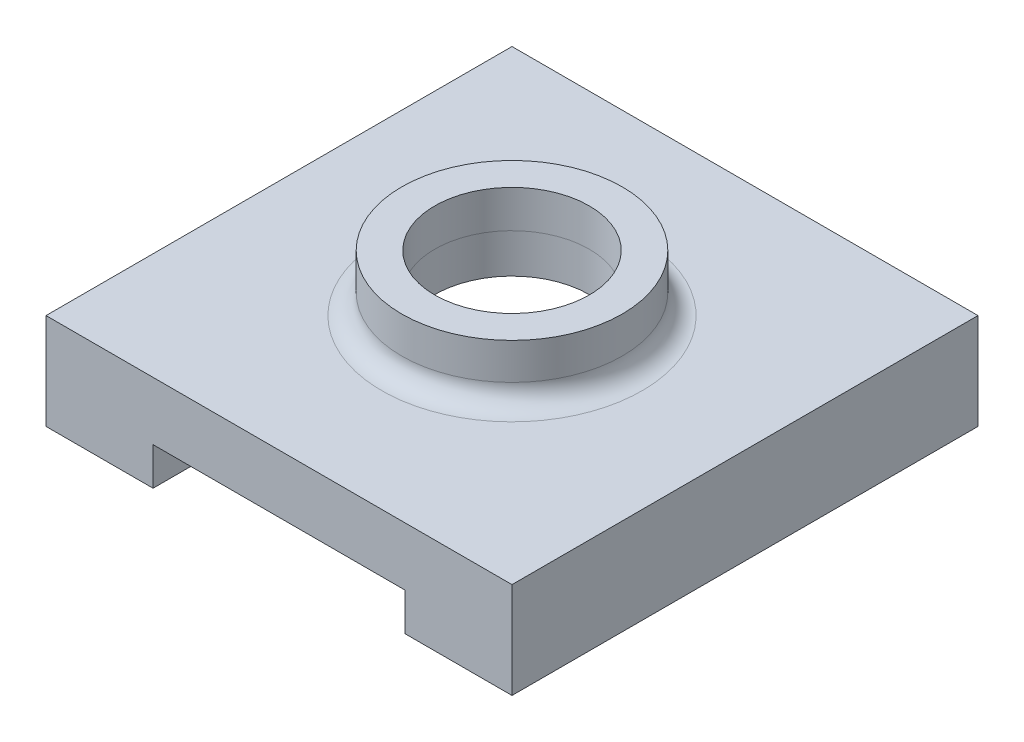
ISO-10303-21;
HEADER;
FILE_DESCRIPTION(('STEP AP214'),'2;1');
FILE_NAME('part.step','',(''),(''),'','','');
FILE_SCHEMA(('AUTOMOTIVE_DESIGN { 1 0 10303 214 1 1 1 1 }'));
ENDSEC;
DATA;
#1=APPLICATION_CONTEXT('core data for automotive mechanical design processes');
#2=APPLICATION_PROTOCOL_DEFINITION('international standard','automotive_design',2000,#1);
#3=PRODUCT_CONTEXT('',#1,'mechanical');
#4=PRODUCT('Part','Part','',(#3));
#5=PRODUCT_RELATED_PRODUCT_CATEGORY('part','',(#4));
#6=PRODUCT_DEFINITION_FORMATION('','',#4);
#7=PRODUCT_DEFINITION_CONTEXT('part definition',#1,'design');
#8=PRODUCT_DEFINITION('design','',#6,#7);
#9=PRODUCT_DEFINITION_SHAPE('','',#8);
#10=(LENGTH_UNIT() NAMED_UNIT(*) SI_UNIT(.MILLI.,.METRE.));
#11=(NAMED_UNIT(*) PLANE_ANGLE_UNIT() SI_UNIT($,.RADIAN.));
#12=(NAMED_UNIT(*) SI_UNIT($,.STERADIAN.) SOLID_ANGLE_UNIT());
#13=UNCERTAINTY_MEASURE_WITH_UNIT(LENGTH_MEASURE(1.E-05),#10,'distance_accuracy_value','');
#14=(GEOMETRIC_REPRESENTATION_CONTEXT(3) GLOBAL_UNCERTAINTY_ASSIGNED_CONTEXT((#13)) GLOBAL_UNIT_ASSIGNED_CONTEXT((#10,
#11,#12)) REPRESENTATION_CONTEXT('',''));
#15=CARTESIAN_POINT('',(0.,0.,0.));
#16=DIRECTION('',(0.,0.,1.));
#17=DIRECTION('',(1.,0.,0.));
#18=AXIS2_PLACEMENT_3D('',#15,#16,#17);
#19=CARTESIAN_POINT('',(0.,18.25,0.));
#20=DIRECTION('',(0.,1.,0.));
#21=DIRECTION('',(0.,0.,1.));
#22=AXIS2_PLACEMENT_3D('',#19,#20,#21);
#23=CYLINDRICAL_SURFACE('',#22,12.2682);
#24=CARTESIAN_POINT('',(0.,18.25,0.));
#25=DIRECTION('',(0.,1.,0.));
#26=DIRECTION('',(0.,0.,1.));
#27=AXIS2_PLACEMENT_3D('',#24,#25,#26);
#28=CIRCLE('',#27,12.2682);
#29=CARTESIAN_POINT('',(0.,18.25,12.2682));
#30=VERTEX_POINT('',#29);
#31=EDGE_CURVE('E336',#30,#30,#28,.F.);
#32=ORIENTED_EDGE('',*,*,#31,.F.);
#33=EDGE_LOOP('',(#32));
#34=FACE_BOUND('',#33,.T.);
#35=CARTESIAN_POINT('',(0.,12.,0.));
#36=DIRECTION('',(0.,-1.,0.));
#37=DIRECTION('',(0.,0.,-1.));
#38=AXIS2_PLACEMENT_3D('',#35,#36,#37);
#39=CIRCLE('',#38,12.2682);
#40=CARTESIAN_POINT('',(0.,12.,-12.2682));
#41=VERTEX_POINT('',#40);
#42=EDGE_CURVE('E49',#41,#41,#39,.F.);
#43=ORIENTED_EDGE('',*,*,#42,.F.);
#44=EDGE_LOOP('',(#43));
#45=FACE_BOUND('',#44,.T.);
#46=ADVANCED_FACE('F45',(#34,#45),#23,.F.);
#47=CARTESIAN_POINT('',(-20.,6.,-40.));
#48=DIRECTION('',(-1.,0.,0.));
#49=DIRECTION('',(0.,0.,1.));
#50=AXIS2_PLACEMENT_3D('',#47,#48,#49);
#51=PLANE('',#50);
#52=DIRECTION('',(0.,1.,0.));
#53=VECTOR('',#52,1.);
#54=CARTESIAN_POINT('',(-20.,5.99999999999999,37.));
#55=LINE('',#54,#53);
#56=CARTESIAN_POINT('',(-20.,0.,37.));
#57=VERTEX_POINT('',#56);
#58=CARTESIAN_POINT('',(-20.,6.,37.));
#59=VERTEX_POINT('',#58);
#60=EDGE_CURVE('E272',#57,#59,#55,.T.);
#61=ORIENTED_EDGE('',*,*,#60,.F.);
#62=DIRECTION('',(0.,0.,-1.));
#63=VECTOR('',#62,1.);
#64=CARTESIAN_POINT('',(-20.,0.,-40.));
#65=LINE('',#64,#63);
#66=CARTESIAN_POINT('',(-20.,0.,25.));
#67=VERTEX_POINT('',#66);
#68=EDGE_CURVE('E347',#57,#67,#65,.T.);
#69=ORIENTED_EDGE('',*,*,#68,.T.);
#70=DIRECTION('',(0.,1.,0.));
#71=VECTOR('',#70,1.);
#72=CARTESIAN_POINT('',(-20.,6.,25.));
#73=LINE('',#72,#71);
#74=CARTESIAN_POINT('',(-20.,6.,25.));
#75=VERTEX_POINT('',#74);
#76=EDGE_CURVE('E324',#67,#75,#73,.T.);
#77=ORIENTED_EDGE('',*,*,#76,.T.);
#78=DIRECTION('',(0.,0.,-1.));
#79=VECTOR('',#78,1.);
#80=CARTESIAN_POINT('',(-20.,6.,-40.));
#81=LINE('',#80,#79);
#82=EDGE_CURVE('E340',#59,#75,#81,.T.);
#83=ORIENTED_EDGE('',*,*,#82,.F.);
#84=EDGE_LOOP('',(#61,#69,#77,#83));
#85=FACE_BOUND('',#84,.T.);
#86=ADVANCED_FACE('F437',(#85),#51,.F.);
#87=CARTESIAN_POINT('',(20.,6.,40.));
#88=DIRECTION('',(1.,0.,0.));
#89=DIRECTION('',(0.,0.,-1.));
#90=AXIS2_PLACEMENT_3D('',#87,#88,#89);
#91=PLANE('',#90);
#92=DIRECTION('',(0.,-1.,0.));
#93=VECTOR('',#92,1.);
#94=CARTESIAN_POINT('',(20.,6.,37.));
#95=LINE('',#94,#93);
#96=CARTESIAN_POINT('',(20.,6.,37.));
#97=VERTEX_POINT('',#96);
#98=CARTESIAN_POINT('',(20.,0.,37.));
#99=VERTEX_POINT('',#98);
#100=EDGE_CURVE('E270',#97,#99,#95,.T.);
#101=ORIENTED_EDGE('',*,*,#100,.F.);
#102=DIRECTION('',(0.,0.,1.));
#103=VECTOR('',#102,1.);
#104=CARTESIAN_POINT('',(20.,6.,40.));
#105=LINE('',#104,#103);
#106=CARTESIAN_POINT('',(20.,6.,25.));
#107=VERTEX_POINT('',#106);
#108=EDGE_CURVE('E342',#107,#97,#105,.T.);
#109=ORIENTED_EDGE('',*,*,#108,.F.);
#110=DIRECTION('',(0.,-1.,0.));
#111=VECTOR('',#110,1.);
#112=CARTESIAN_POINT('',(20.,6.,25.));
#113=LINE('',#112,#111);
#114=CARTESIAN_POINT('',(20.,0.,25.));
#115=VERTEX_POINT('',#114);
#116=EDGE_CURVE('E321',#107,#115,#113,.T.);
#117=ORIENTED_EDGE('',*,*,#116,.T.);
#118=DIRECTION('',(0.,0.,1.));
#119=VECTOR('',#118,1.);
#120=CARTESIAN_POINT('',(20.,0.,40.));
#121=LINE('',#120,#119);
#122=EDGE_CURVE('E349',#115,#99,#121,.T.);
#123=ORIENTED_EDGE('',*,*,#122,.T.);
#124=EDGE_LOOP('',(#101,#109,#117,#123));
#125=FACE_BOUND('',#124,.T.);
#126=ADVANCED_FACE('F462',(#125),#91,.F.);
#127=CARTESIAN_POINT('',(0.,6.,0.));
#128=DIRECTION('',(0.,1.,0.));
#129=DIRECTION('',(0.,0.,1.));
#130=AXIS2_PLACEMENT_3D('',#127,#128,#129);
#131=PLANE('',#130);
#132=DIRECTION('',(1.,0.,0.));
#133=VECTOR('',#132,1.);
#134=CARTESIAN_POINT('',(0.,6.,37.));
#135=LINE('',#134,#133);
#136=EDGE_CURVE('E263',#59,#97,#135,.T.);
#137=ORIENTED_EDGE('',*,*,#136,.F.);
#138=ORIENTED_EDGE('',*,*,#82,.T.);
#139=DIRECTION('',(1.,0.,0.));
#140=VECTOR('',#139,1.);
#141=CARTESIAN_POINT('',(0.,6.,25.));
#142=LINE('',#141,#140);
#143=EDGE_CURVE('E354',#75,#107,#142,.T.);
#144=ORIENTED_EDGE('',*,*,#143,.T.);
#145=ORIENTED_EDGE('',*,*,#108,.T.);
#146=EDGE_LOOP('',(#137,#138,#144,#145));
#147=FACE_BOUND('',#146,.T.);
#148=ADVANCED_FACE('F470',(#147),#131,.F.);
#149=CARTESIAN_POINT('',(-40.,0.,0.));
#150=DIRECTION('',(0.,-1.,0.));
#151=DIRECTION('',(0.,0.,-1.));
#152=AXIS2_PLACEMENT_3D('',#149,#150,#151);
#153=PLANE('',#152);
#154=CARTESIAN_POINT('',(-30.,0.,-27.5));
#155=DIRECTION('',(0.,-1.,0.));
#156=DIRECTION('',(0.,0.,-1.));
#157=AXIS2_PLACEMENT_3D('',#154,#155,#156);
#158=CIRCLE('',#157,1.65);
#159=CARTESIAN_POINT('',(-30.,0.,-29.15));
#160=VERTEX_POINT('',#159);
#161=EDGE_CURVE('E279',#160,#160,#158,.T.);
#162=ORIENTED_EDGE('',*,*,#161,.F.);
#163=EDGE_LOOP('',(#162));
#164=FACE_BOUND('',#163,.T.);
#165=CARTESIAN_POINT('',(-30.,0.,27.5));
#166=DIRECTION('',(0.,-1.,0.));
#167=DIRECTION('',(0.,0.,-1.));
#168=AXIS2_PLACEMENT_3D('',#165,#166,#167);
#169=CIRCLE('',#168,1.65);
#170=CARTESIAN_POINT('',(-30.,0.,25.85));
#171=VERTEX_POINT('',#170);
#172=EDGE_CURVE('E297',#171,#171,#169,.T.);
#173=ORIENTED_EDGE('',*,*,#172,.F.);
#174=EDGE_LOOP('',(#173));
#175=FACE_BOUND('',#174,.T.);
#176=DIRECTION('',(0.,0.,1.));
#177=VECTOR('',#176,1.);
#178=CARTESIAN_POINT('',(-37.,0.,-37.));
#179=LINE('',#178,#177);
#180=CARTESIAN_POINT('',(-37.,0.,-37.));
#181=VERTEX_POINT('',#180);
#182=CARTESIAN_POINT('',(-37.,0.,37.));
#183=VERTEX_POINT('',#182);
#184=EDGE_CURVE('E238',#181,#183,#179,.T.);
#185=ORIENTED_EDGE('',*,*,#184,.F.);
#186=DIRECTION('',(-1.,0.,0.));
#187=VECTOR('',#186,1.);
#188=CARTESIAN_POINT('',(37.,0.,-37.));
#189=LINE('',#188,#187);
#190=CARTESIAN_POINT('',(-20.,0.,-37.));
#191=VERTEX_POINT('',#190);
#192=EDGE_CURVE('E248',#191,#181,#189,.T.);
#193=ORIENTED_EDGE('',*,*,#192,.F.);
#194=CARTESIAN_POINT('',(-20.,0.,-25.));
#195=VERTEX_POINT('',#194);
#196=EDGE_CURVE('E339',#195,#191,#65,.T.);
#197=ORIENTED_EDGE('',*,*,#196,.F.);
#198=DIRECTION('',(1.,0.,0.));
#199=VECTOR('',#198,1.);
#200=CARTESIAN_POINT('',(-25.,0.,-25.));
#201=LINE('',#200,#199);
#202=CARTESIAN_POINT('',(-21.825,0.,-25.));
#203=VERTEX_POINT('',#202);
#204=EDGE_CURVE('E307',#203,#195,#201,.T.);
#205=ORIENTED_EDGE('',*,*,#204,.F.);
#206=CARTESIAN_POINT('',(-21.825,0.,-21.825));
#207=DIRECTION('',(0.,-1.,0.));
#208=DIRECTION('',(0.,0.,-1.));
#209=AXIS2_PLACEMENT_3D('',#206,#207,#208);
#210=CIRCLE('',#209,3.175);
#211=CARTESIAN_POINT('',(-25.,0.,-21.825));
#212=VERTEX_POINT('',#211);
#213=EDGE_CURVE('E12',#203,#212,#210,.F.);
#214=ORIENTED_EDGE('',*,*,#213,.T.);
#215=DIRECTION('',(0.,0.,-1.));
#216=VECTOR('',#215,1.);
#217=CARTESIAN_POINT('',(-25.,0.,25.));
#218=LINE('',#217,#216);
#219=CARTESIAN_POINT('',(-25.,0.,21.825));
#220=VERTEX_POINT('',#219);
#221=EDGE_CURVE('E303',#220,#212,#218,.T.);
#222=ORIENTED_EDGE('',*,*,#221,.F.);
#223=CARTESIAN_POINT('',(-21.825,0.,21.825));
#224=DIRECTION('',(0.,-1.,0.));
#225=DIRECTION('',(0.,0.,-1.));
#226=AXIS2_PLACEMENT_3D('',#223,#224,#225);
#227=CIRCLE('',#226,3.175);
#228=CARTESIAN_POINT('',(-21.825,0.,25.));
#229=VERTEX_POINT('',#228);
#230=EDGE_CURVE('E378',#220,#229,#227,.F.);
#231=ORIENTED_EDGE('',*,*,#230,.T.);
#232=DIRECTION('',(-1.,0.,0.));
#233=VECTOR('',#232,1.);
#234=CARTESIAN_POINT('',(25.,0.,25.));
#235=LINE('',#234,#233);
#236=EDGE_CURVE('E312',#67,#229,#235,.T.);
#237=ORIENTED_EDGE('',*,*,#236,.F.);
#238=ORIENTED_EDGE('',*,*,#68,.F.);
#239=DIRECTION('',(1.,0.,0.));
#240=VECTOR('',#239,1.);
#241=CARTESIAN_POINT('',(-37.,0.,37.));
#242=LINE('',#241,#240);
#243=EDGE_CURVE('E243',#183,#57,#242,.T.);
#244=ORIENTED_EDGE('',*,*,#243,.F.);
#245=EDGE_LOOP('',(#185,#193,#197,#205,#214,#222,#231,#237,#238,#244));
#246=FACE_BOUND('',#245,.T.);
#247=ADVANCED_FACE('F402',(#164,#175,#246),#153,.T.);
#248=CARTESIAN_POINT('',(30.,0.,-27.5));
#249=DIRECTION('',(0.,-1.,0.));
#250=DIRECTION('',(0.,0.,-1.));
#251=AXIS2_PLACEMENT_3D('',#248,#249,#250);
#252=CIRCLE('',#251,1.65);
#253=CARTESIAN_POINT('',(30.,0.,-29.15));
#254=VERTEX_POINT('',#253);
#255=EDGE_CURVE('E285',#254,#254,#252,.T.);
#256=ORIENTED_EDGE('',*,*,#255,.F.);
#257=EDGE_LOOP('',(#256));
#258=FACE_BOUND('',#257,.T.);
#259=CARTESIAN_POINT('',(30.,0.,27.5));
#260=DIRECTION('',(0.,-1.,0.));
#261=DIRECTION('',(0.,0.,-1.));
#262=AXIS2_PLACEMENT_3D('',#259,#260,#261);
#263=CIRCLE('',#262,1.65);
#264=CARTESIAN_POINT('',(30.,0.,25.85));
#265=VERTEX_POINT('',#264);
#266=EDGE_CURVE('E291',#265,#265,#263,.T.);
#267=ORIENTED_EDGE('',*,*,#266,.F.);
#268=EDGE_LOOP('',(#267));
#269=FACE_BOUND('',#268,.T.);
#270=CARTESIAN_POINT('',(20.,0.,-37.));
#271=VERTEX_POINT('',#270);
#272=CARTESIAN_POINT('',(20.,0.,-25.));
#273=VERTEX_POINT('',#272);
#274=EDGE_CURVE('E350',#271,#273,#121,.T.);
#275=ORIENTED_EDGE('',*,*,#274,.F.);
#276=CARTESIAN_POINT('',(37.,0.,-37.));
#277=VERTEX_POINT('',#276);
#278=EDGE_CURVE('E249',#277,#271,#189,.T.);
#279=ORIENTED_EDGE('',*,*,#278,.F.);
#280=DIRECTION('',(0.,0.,-1.));
#281=VECTOR('',#280,1.);
#282=CARTESIAN_POINT('',(37.,0.,37.));
#283=LINE('',#282,#281);
#284=CARTESIAN_POINT('',(37.,0.,37.));
#285=VERTEX_POINT('',#284);
#286=EDGE_CURVE('E245',#285,#277,#283,.T.);
#287=ORIENTED_EDGE('',*,*,#286,.F.);
#288=EDGE_CURVE('E241',#99,#285,#242,.T.);
#289=ORIENTED_EDGE('',*,*,#288,.F.);
#290=ORIENTED_EDGE('',*,*,#122,.F.);
#291=CARTESIAN_POINT('',(21.825,0.,25.));
#292=VERTEX_POINT('',#291);
#293=EDGE_CURVE('E313',#292,#115,#235,.T.);
#294=ORIENTED_EDGE('',*,*,#293,.F.);
#295=CARTESIAN_POINT('',(21.825,0.,21.825));
#296=DIRECTION('',(0.,-1.,0.));
#297=DIRECTION('',(0.,0.,-1.));
#298=AXIS2_PLACEMENT_3D('',#295,#296,#297);
#299=CIRCLE('',#298,3.175);
#300=CARTESIAN_POINT('',(25.,0.,21.825));
#301=VERTEX_POINT('',#300);
#302=EDGE_CURVE('E202',#292,#301,#299,.F.);
#303=ORIENTED_EDGE('',*,*,#302,.T.);
#304=DIRECTION('',(0.,0.,1.));
#305=VECTOR('',#304,1.);
#306=CARTESIAN_POINT('',(25.,0.,-25.));
#307=LINE('',#306,#305);
#308=CARTESIAN_POINT('',(25.,0.,-21.825));
#309=VERTEX_POINT('',#308);
#310=EDGE_CURVE('E309',#309,#301,#307,.T.);
#311=ORIENTED_EDGE('',*,*,#310,.F.);
#312=CARTESIAN_POINT('',(21.825,0.,-21.825));
#313=DIRECTION('',(0.,-1.,0.));
#314=DIRECTION('',(0.,0.,-1.));
#315=AXIS2_PLACEMENT_3D('',#312,#313,#314);
#316=CIRCLE('',#315,3.175);
#317=CARTESIAN_POINT('',(21.825,0.,-25.));
#318=VERTEX_POINT('',#317);
#319=EDGE_CURVE('E54',#309,#318,#316,.F.);
#320=ORIENTED_EDGE('',*,*,#319,.T.);
#321=EDGE_CURVE('E306',#273,#318,#201,.T.);
#322=ORIENTED_EDGE('',*,*,#321,.F.);
#323=EDGE_LOOP('',(#275,#279,#287,#289,#290,#294,#303,#311,#320,#322));
#324=FACE_BOUND('',#323,.T.);
#325=ADVANCED_FACE('F386',(#258,#269,#324),#153,.T.);
#326=DIRECTION('',(0.,-1.,0.));
#327=VECTOR('',#326,1.);
#328=CARTESIAN_POINT('',(-20.,6.,-37.));
#329=LINE('',#328,#327);
#330=CARTESIAN_POINT('',(-20.,6.,-37.));
#331=VERTEX_POINT('',#330);
#332=EDGE_CURVE('E277',#331,#191,#329,.T.);
#333=ORIENTED_EDGE('',*,*,#332,.F.);
#334=CARTESIAN_POINT('',(-20.,6.,-25.));
#335=VERTEX_POINT('',#334);
#336=EDGE_CURVE('E343',#335,#331,#81,.T.);
#337=ORIENTED_EDGE('',*,*,#336,.F.);
#338=DIRECTION('',(0.,-1.,0.));
#339=VECTOR('',#338,1.);
#340=CARTESIAN_POINT('',(-20.,6.,-25.));
#341=LINE('',#340,#339);
#342=EDGE_CURVE('E318',#335,#195,#341,.T.);
#343=ORIENTED_EDGE('',*,*,#342,.T.);
#344=ORIENTED_EDGE('',*,*,#196,.T.);
#345=EDGE_LOOP('',(#333,#337,#343,#344));
#346=FACE_BOUND('',#345,.T.);
#347=ADVANCED_FACE('F408',(#346),#51,.F.);
#348=DIRECTION('',(0.,1.,0.));
#349=VECTOR('',#348,1.);
#350=CARTESIAN_POINT('',(20.,6.00000000000001,-37.));
#351=LINE('',#350,#349);
#352=CARTESIAN_POINT('',(20.,6.,-37.));
#353=VERTEX_POINT('',#352);
#354=EDGE_CURVE('E61',#271,#353,#351,.T.);
#355=ORIENTED_EDGE('',*,*,#354,.F.);
#356=ORIENTED_EDGE('',*,*,#274,.T.);
#357=DIRECTION('',(0.,1.,0.));
#358=VECTOR('',#357,1.);
#359=CARTESIAN_POINT('',(20.,6.,-25.));
#360=LINE('',#359,#358);
#361=CARTESIAN_POINT('',(20.,6.,-25.));
#362=VERTEX_POINT('',#361);
#363=EDGE_CURVE('E315',#273,#362,#360,.T.);
#364=ORIENTED_EDGE('',*,*,#363,.T.);
#365=EDGE_CURVE('E344',#353,#362,#105,.T.);
#366=ORIENTED_EDGE('',*,*,#365,.F.);
#367=EDGE_LOOP('',(#355,#356,#364,#366));
#368=FACE_BOUND('',#367,.T.);
#369=ADVANCED_FACE('F415',(#368),#91,.F.);
#370=DIRECTION('',(-1.,0.,0.));
#371=VECTOR('',#370,1.);
#372=CARTESIAN_POINT('',(0.,6.,-37.));
#373=LINE('',#372,#371);
#374=EDGE_CURVE('E274',#353,#331,#373,.T.);
#375=ORIENTED_EDGE('',*,*,#374,.F.);
#376=ORIENTED_EDGE('',*,*,#365,.T.);
#377=DIRECTION('',(-1.,0.,0.));
#378=VECTOR('',#377,1.);
#379=CARTESIAN_POINT('',(0.,6.,-25.));
#380=LINE('',#379,#378);
#381=EDGE_CURVE('E346',#362,#335,#380,.T.);
#382=ORIENTED_EDGE('',*,*,#381,.T.);
#383=ORIENTED_EDGE('',*,*,#336,.T.);
#384=EDGE_LOOP('',(#375,#376,#382,#383));
#385=FACE_BOUND('',#384,.T.);
#386=ADVANCED_FACE('F412',(#385),#131,.F.);
#387=CARTESIAN_POINT('',(0.,15.25,0.));
#388=DIRECTION('',(0.,-1.,0.));
#389=DIRECTION('',(0.,0.,-1.));
#390=AXIS2_PLACEMENT_3D('',#387,#388,#389);
#391=PLANE('',#390);
#392=CARTESIAN_POINT('',(0.,15.25,0.));
#393=DIRECTION('',(0.,-1.,0.));
#394=DIRECTION('',(0.,0.,-1.));
#395=AXIS2_PLACEMENT_3D('',#392,#393,#394);
#396=CIRCLE('',#395,20.675);
#397=CARTESIAN_POINT('',(0.,15.25,-20.675));
#398=VERTEX_POINT('',#397);
#399=EDGE_CURVE('E375',#398,#398,#396,.T.);
#400=ORIENTED_EDGE('',*,*,#399,.T.);
#401=EDGE_LOOP('',(#400));
#402=FACE_BOUND('',#401,.T.);
#403=DIRECTION('',(0.,0.,1.));
#404=VECTOR('',#403,1.);
#405=CARTESIAN_POINT('',(-37.,15.25,-37.));
#406=LINE('',#405,#404);
#407=CARTESIAN_POINT('',(-37.,15.25,-37.));
#408=VERTEX_POINT('',#407);
#409=CARTESIAN_POINT('',(-37.,15.25,37.));
#410=VERTEX_POINT('',#409);
#411=EDGE_CURVE('E252',#408,#410,#406,.T.);
#412=ORIENTED_EDGE('',*,*,#411,.T.);
#413=DIRECTION('',(1.,0.,0.));
#414=VECTOR('',#413,1.);
#415=CARTESIAN_POINT('',(-37.,15.25,37.));
#416=LINE('',#415,#414);
#417=CARTESIAN_POINT('',(37.,15.25,37.));
#418=VERTEX_POINT('',#417);
#419=EDGE_CURVE('E255',#410,#418,#416,.T.);
#420=ORIENTED_EDGE('',*,*,#419,.T.);
#421=DIRECTION('',(0.,0.,-1.));
#422=VECTOR('',#421,1.);
#423=CARTESIAN_POINT('',(37.,15.25,37.));
#424=LINE('',#423,#422);
#425=CARTESIAN_POINT('',(37.,15.25,-37.));
#426=VERTEX_POINT('',#425);
#427=EDGE_CURVE('E69',#418,#426,#424,.T.);
#428=ORIENTED_EDGE('',*,*,#427,.T.);
#429=DIRECTION('',(-1.,0.,0.));
#430=VECTOR('',#429,1.);
#431=CARTESIAN_POINT('',(37.,15.25,-37.));
#432=LINE('',#431,#430);
#433=EDGE_CURVE('E242',#426,#408,#432,.T.);
#434=ORIENTED_EDGE('',*,*,#433,.T.);
#435=EDGE_LOOP('',(#412,#420,#428,#434));
#436=FACE_BOUND('',#435,.T.);
#437=ADVANCED_FACE('F426',(#402,#436),#391,.F.);
#438=CARTESIAN_POINT('',(0.,18.25,0.));
#439=DIRECTION('',(0.,1.,0.));
#440=DIRECTION('',(0.,0.,1.));
#441=AXIS2_PLACEMENT_3D('',#438,#439,#440);
#442=PLANE('',#441);
#443=CARTESIAN_POINT('',(0.,18.25,0.));
#444=DIRECTION('',(0.,1.,0.));
#445=DIRECTION('',(0.,0.,1.));
#446=AXIS2_PLACEMENT_3D('',#443,#444,#445);
#447=CIRCLE('',#446,12.268);
#448=CARTESIAN_POINT('',(0.,18.25,12.268));
#449=VERTEX_POINT('',#448);
#450=EDGE_CURVE('E327',#449,#449,#447,.T.);
#451=ORIENTED_EDGE('',*,*,#450,.T.);
#452=EDGE_LOOP('',(#451));
#453=FACE_BOUND('',#452,.T.);
#454=ORIENTED_EDGE('',*,*,#31,.T.);
#455=EDGE_LOOP('',(#454));
#456=FACE_BOUND('',#455,.T.);
#457=ADVANCED_FACE('F596',(#453,#456),#442,.F.);
#458=CARTESIAN_POINT('',(0.,24.2062,0.));
#459=DIRECTION('',(0.,1.,0.));
#460=DIRECTION('',(0.,0.,1.));
#461=AXIS2_PLACEMENT_3D('',#458,#459,#460);
#462=PLANE('',#461);
#463=CARTESIAN_POINT('',(0.,24.2062,0.));
#464=DIRECTION('',(0.,1.,0.));
#465=DIRECTION('',(0.,0.,1.));
#466=AXIS2_PLACEMENT_3D('',#463,#464,#465);
#467=CIRCLE('',#466,17.5);
#468=CARTESIAN_POINT('',(0.,24.2062,17.5));
#469=VERTEX_POINT('',#468);
#470=EDGE_CURVE('E331',#469,#469,#467,.T.);
#471=ORIENTED_EDGE('',*,*,#470,.T.);
#472=EDGE_LOOP('',(#471));
#473=FACE_BOUND('',#472,.T.);
#474=CARTESIAN_POINT('',(0.,24.2062,0.));
#475=DIRECTION('',(0.,1.,0.));
#476=DIRECTION('',(0.,0.,1.));
#477=AXIS2_PLACEMENT_3D('',#474,#475,#476);
#478=CIRCLE('',#477,12.268);
#479=CARTESIAN_POINT('',(0.,24.2062,12.268));
#480=VERTEX_POINT('',#479);
#481=EDGE_CURVE('E328',#480,#480,#478,.T.);
#482=ORIENTED_EDGE('',*,*,#481,.F.);
#483=EDGE_LOOP('',(#482));
#484=FACE_BOUND('',#483,.T.);
#485=ADVANCED_FACE('F605',(#473,#484),#462,.T.);
#486=CARTESIAN_POINT('',(0.,24.2062,0.));
#487=DIRECTION('',(0.,-1.,0.));
#488=DIRECTION('',(0.,0.,-1.));
#489=AXIS2_PLACEMENT_3D('',#486,#487,#488);
#490=CYLINDRICAL_SURFACE('',#489,17.5);
#491=CARTESIAN_POINT('',(0.,18.425,0.));
#492=DIRECTION('',(0.,-1.,0.));
#493=DIRECTION('',(0.,0.,-1.));
#494=AXIS2_PLACEMENT_3D('',#491,#492,#493);
#495=CIRCLE('',#494,17.5);
#496=CARTESIAN_POINT('',(0.,18.425,-17.5));
#497=VERTEX_POINT('',#496);
#498=EDGE_CURVE('E372',#497,#497,#495,.F.);
#499=ORIENTED_EDGE('',*,*,#498,.T.);
#500=EDGE_LOOP('',(#499));
#501=FACE_BOUND('',#500,.T.);
#502=ORIENTED_EDGE('',*,*,#470,.F.);
#503=EDGE_LOOP('',(#502));
#504=FACE_BOUND('',#503,.T.);
#505=ADVANCED_FACE('F468',(#501,#504),#490,.T.);
#506=CARTESIAN_POINT('',(0.,24.2062,0.));
#507=DIRECTION('',(0.,-1.,0.));
#508=DIRECTION('',(0.,0.,-1.));
#509=AXIS2_PLACEMENT_3D('',#506,#507,#508);
#510=CYLINDRICAL_SURFACE('',#509,12.268);
#511=ORIENTED_EDGE('',*,*,#481,.T.);
#512=EDGE_LOOP('',(#511));
#513=FACE_BOUND('',#512,.T.);
#514=ORIENTED_EDGE('',*,*,#450,.F.);
#515=EDGE_LOOP('',(#514));
#516=FACE_BOUND('',#515,.T.);
#517=ADVANCED_FACE('F620',(#513,#516),#510,.F.);
#518=CARTESIAN_POINT('',(25.,9.,25.));
#519=DIRECTION('',(0.,0.,1.));
#520=DIRECTION('',(1.,0.,0.));
#521=AXIS2_PLACEMENT_3D('',#518,#519,#520);
#522=PLANE('',#521);
#523=ORIENTED_EDGE('',*,*,#236,.T.);
#524=DIRECTION('',(0.,-1.,0.));
#525=VECTOR('',#524,1.);
#526=CARTESIAN_POINT('',(-21.825,9.,25.));
#527=LINE('',#526,#525);
#528=CARTESIAN_POINT('',(-21.825,12.,25.));
#529=VERTEX_POINT('',#528);
#530=EDGE_CURVE('E205',#229,#529,#527,.F.);
#531=ORIENTED_EDGE('',*,*,#530,.T.);
#532=DIRECTION('',(-1.,0.,0.));
#533=VECTOR('',#532,1.);
#534=CARTESIAN_POINT('',(21.825,12.,25.));
#535=LINE('',#534,#533);
#536=CARTESIAN_POINT('',(21.825,12.,25.));
#537=VERTEX_POINT('',#536);
#538=EDGE_CURVE('E209',#537,#529,#535,.T.);
#539=ORIENTED_EDGE('',*,*,#538,.F.);
#540=DIRECTION('',(0.,-1.,0.));
#541=VECTOR('',#540,1.);
#542=CARTESIAN_POINT('',(21.825,0.,25.));
#543=LINE('',#542,#541);
#544=EDGE_CURVE('E195',#537,#292,#543,.T.);
#545=ORIENTED_EDGE('',*,*,#544,.T.);
#546=ORIENTED_EDGE('',*,*,#293,.T.);
#547=ORIENTED_EDGE('',*,*,#116,.F.);
#548=ORIENTED_EDGE('',*,*,#143,.F.);
#549=ORIENTED_EDGE('',*,*,#76,.F.);
#550=EDGE_LOOP('',(#523,#531,#539,#545,#546,#547,#548,#549));
#551=FACE_BOUND('',#550,.T.);
#552=ADVANCED_FACE('F211',(#551),#522,.F.);
#553=CARTESIAN_POINT('',(-25.,9.,-25.));
#554=DIRECTION('',(0.,0.,-1.));
#555=DIRECTION('',(-1.,0.,0.));
#556=AXIS2_PLACEMENT_3D('',#553,#554,#555);
#557=PLANE('',#556);
#558=ORIENTED_EDGE('',*,*,#321,.T.);
#559=DIRECTION('',(0.,-1.,0.));
#560=VECTOR('',#559,1.);
#561=CARTESIAN_POINT('',(21.825,9.,-25.));
#562=LINE('',#561,#560);
#563=CARTESIAN_POINT('',(21.825,12.,-25.));
#564=VERTEX_POINT('',#563);
#565=EDGE_CURVE('E370',#318,#564,#562,.F.);
#566=ORIENTED_EDGE('',*,*,#565,.T.);
#567=DIRECTION('',(1.,0.,0.));
#568=VECTOR('',#567,1.);
#569=CARTESIAN_POINT('',(-21.825,12.,-25.));
#570=LINE('',#569,#568);
#571=CARTESIAN_POINT('',(-21.825,12.,-25.));
#572=VERTEX_POINT('',#571);
#573=EDGE_CURVE('E232',#572,#564,#570,.T.);
#574=ORIENTED_EDGE('',*,*,#573,.F.);
#575=DIRECTION('',(0.,-1.,0.));
#576=VECTOR('',#575,1.);
#577=CARTESIAN_POINT('',(-21.825,0.,-25.));
#578=LINE('',#577,#576);
#579=EDGE_CURVE('E367',#572,#203,#578,.T.);
#580=ORIENTED_EDGE('',*,*,#579,.T.);
#581=ORIENTED_EDGE('',*,*,#204,.T.);
#582=ORIENTED_EDGE('',*,*,#342,.F.);
#583=ORIENTED_EDGE('',*,*,#381,.F.);
#584=ORIENTED_EDGE('',*,*,#363,.F.);
#585=EDGE_LOOP('',(#558,#566,#574,#580,#581,#582,#583,#584));
#586=FACE_BOUND('',#585,.T.);
#587=ADVANCED_FACE('F391',(#586),#557,.F.);
#588=CARTESIAN_POINT('',(-25.,9.,25.));
#589=DIRECTION('',(-1.,0.,0.));
#590=DIRECTION('',(0.,0.,1.));
#591=AXIS2_PLACEMENT_3D('',#588,#589,#590);
#592=PLANE('',#591);
#593=DIRECTION('',(0.,-1.,0.));
#594=VECTOR('',#593,1.);
#595=CARTESIAN_POINT('',(-25.,9.,-21.825));
#596=LINE('',#595,#594);
#597=CARTESIAN_POINT('',(-25.,12.,-21.825));
#598=VERTEX_POINT('',#597);
#599=EDGE_CURVE('E357',#212,#598,#596,.F.);
#600=ORIENTED_EDGE('',*,*,#599,.T.);
#601=DIRECTION('',(0.,0.,-1.));
#602=VECTOR('',#601,1.);
#603=CARTESIAN_POINT('',(-25.,12.,21.825));
#604=LINE('',#603,#602);
#605=CARTESIAN_POINT('',(-25.,12.,21.825));
#606=VERTEX_POINT('',#605);
#607=EDGE_CURVE('E226',#606,#598,#604,.T.);
#608=ORIENTED_EDGE('',*,*,#607,.F.);
#609=DIRECTION('',(0.,-1.,0.));
#610=VECTOR('',#609,1.);
#611=CARTESIAN_POINT('',(-25.,0.,21.825));
#612=LINE('',#611,#610);
#613=EDGE_CURVE('E206',#606,#220,#612,.T.);
#614=ORIENTED_EDGE('',*,*,#613,.T.);
#615=ORIENTED_EDGE('',*,*,#221,.T.);
#616=EDGE_LOOP('',(#600,#608,#614,#615));
#617=FACE_BOUND('',#616,.T.);
#618=ADVANCED_FACE('F445',(#617),#592,.F.);
#619=CARTESIAN_POINT('',(25.,9.,-25.));
#620=DIRECTION('',(1.,0.,0.));
#621=DIRECTION('',(0.,0.,-1.));
#622=AXIS2_PLACEMENT_3D('',#619,#620,#621);
#623=PLANE('',#622);
#624=ORIENTED_EDGE('',*,*,#310,.T.);
#625=DIRECTION('',(0.,-1.,0.));
#626=VECTOR('',#625,1.);
#627=CARTESIAN_POINT('',(25.,9.,21.825));
#628=LINE('',#627,#626);
#629=CARTESIAN_POINT('',(25.,12.,21.825));
#630=VERTEX_POINT('',#629);
#631=EDGE_CURVE('E365',#301,#630,#628,.F.);
#632=ORIENTED_EDGE('',*,*,#631,.T.);
#633=DIRECTION('',(0.,0.,1.));
#634=VECTOR('',#633,1.);
#635=CARTESIAN_POINT('',(25.,12.,-21.825));
#636=LINE('',#635,#634);
#637=CARTESIAN_POINT('',(25.,12.,-21.825));
#638=VERTEX_POINT('',#637);
#639=EDGE_CURVE('E222',#638,#630,#636,.T.);
#640=ORIENTED_EDGE('',*,*,#639,.F.);
#641=DIRECTION('',(0.,-1.,0.));
#642=VECTOR('',#641,1.);
#643=CARTESIAN_POINT('',(25.,0.,-21.825));
#644=LINE('',#643,#642);
#645=EDGE_CURVE('E362',#638,#309,#644,.T.);
#646=ORIENTED_EDGE('',*,*,#645,.T.);
#647=EDGE_LOOP('',(#624,#632,#640,#646));
#648=FACE_BOUND('',#647,.T.);
#649=ADVANCED_FACE('F482',(#648),#623,.F.);
#650=CARTESIAN_POINT('',(-21.825,9.,21.825));
#651=DIRECTION('',(0.,1.,0.));
#652=DIRECTION('',(0.,0.,1.));
#653=AXIS2_PLACEMENT_3D('',#650,#651,#652);
#654=CYLINDRICAL_SURFACE('',#653,3.175);
#655=ORIENTED_EDGE('',*,*,#613,.F.);
#656=CARTESIAN_POINT('',(-21.825,12.,21.825));
#657=DIRECTION('',(0.,-1.,0.));
#658=DIRECTION('',(0.,0.,-1.));
#659=AXIS2_PLACEMENT_3D('',#656,#657,#658);
#660=CIRCLE('',#659,3.175);
#661=EDGE_CURVE('E216',#529,#606,#660,.T.);
#662=ORIENTED_EDGE('',*,*,#661,.F.);
#663=ORIENTED_EDGE('',*,*,#530,.F.);
#664=ORIENTED_EDGE('',*,*,#230,.F.);
#665=EDGE_LOOP('',(#655,#662,#663,#664));
#666=FACE_BOUND('',#665,.T.);
#667=ADVANCED_FACE('F442',(#666),#654,.F.);
#668=CARTESIAN_POINT('',(21.825,9.,21.825));
#669=DIRECTION('',(0.,1.,0.));
#670=DIRECTION('',(0.,0.,1.));
#671=AXIS2_PLACEMENT_3D('',#668,#669,#670);
#672=CYLINDRICAL_SURFACE('',#671,3.175);
#673=ORIENTED_EDGE('',*,*,#544,.F.);
#674=CARTESIAN_POINT('',(21.825,12.,21.825));
#675=DIRECTION('',(0.,-1.,0.));
#676=DIRECTION('',(0.,0.,-1.));
#677=AXIS2_PLACEMENT_3D('',#674,#675,#676);
#678=CIRCLE('',#677,3.175);
#679=EDGE_CURVE('E200',#630,#537,#678,.T.);
#680=ORIENTED_EDGE('',*,*,#679,.F.);
#681=ORIENTED_EDGE('',*,*,#631,.F.);
#682=ORIENTED_EDGE('',*,*,#302,.F.);
#683=EDGE_LOOP('',(#673,#680,#681,#682));
#684=FACE_BOUND('',#683,.T.);
#685=ADVANCED_FACE('F197',(#684),#672,.F.);
#686=CARTESIAN_POINT('',(21.825,9.,-21.825));
#687=DIRECTION('',(0.,1.,0.));
#688=DIRECTION('',(0.,0.,1.));
#689=AXIS2_PLACEMENT_3D('',#686,#687,#688);
#690=CYLINDRICAL_SURFACE('',#689,3.175);
#691=ORIENTED_EDGE('',*,*,#645,.F.);
#692=CARTESIAN_POINT('',(21.825,12.,-21.825));
#693=DIRECTION('',(0.,-1.,0.));
#694=DIRECTION('',(0.,0.,-1.));
#695=AXIS2_PLACEMENT_3D('',#692,#693,#694);
#696=CIRCLE('',#695,3.175);
#697=EDGE_CURVE('E235',#564,#638,#696,.T.);
#698=ORIENTED_EDGE('',*,*,#697,.F.);
#699=ORIENTED_EDGE('',*,*,#565,.F.);
#700=ORIENTED_EDGE('',*,*,#319,.F.);
#701=EDGE_LOOP('',(#691,#698,#699,#700));
#702=FACE_BOUND('',#701,.T.);
#703=ADVANCED_FACE('F395',(#702),#690,.F.);
#704=CARTESIAN_POINT('',(-21.825,9.,-21.825));
#705=DIRECTION('',(0.,1.,0.));
#706=DIRECTION('',(0.,0.,1.));
#707=AXIS2_PLACEMENT_3D('',#704,#705,#706);
#708=CYLINDRICAL_SURFACE('',#707,3.175);
#709=ORIENTED_EDGE('',*,*,#579,.F.);
#710=CARTESIAN_POINT('',(-21.825,12.,-21.825));
#711=DIRECTION('',(0.,-1.,0.));
#712=DIRECTION('',(0.,0.,-1.));
#713=AXIS2_PLACEMENT_3D('',#710,#711,#712);
#714=CIRCLE('',#713,3.175);
#715=EDGE_CURVE('E229',#598,#572,#714,.T.);
#716=ORIENTED_EDGE('',*,*,#715,.F.);
#717=ORIENTED_EDGE('',*,*,#599,.F.);
#718=ORIENTED_EDGE('',*,*,#213,.F.);
#719=EDGE_LOOP('',(#709,#716,#717,#718));
#720=FACE_BOUND('',#719,.T.);
#721=ADVANCED_FACE('F447',(#720),#708,.F.);
#722=CARTESIAN_POINT('',(0.,18.425,0.));
#723=DIRECTION('',(0.,-1.,0.));
#724=DIRECTION('',(0.,0.,-1.));
#725=AXIS2_PLACEMENT_3D('',#722,#723,#724);
#726=TOROIDAL_SURFACE('',#725,20.675,3.175);
#727=ORIENTED_EDGE('',*,*,#399,.F.);
#728=EDGE_LOOP('',(#727));
#729=FACE_BOUND('',#728,.T.);
#730=ORIENTED_EDGE('',*,*,#498,.F.);
#731=EDGE_LOOP('',(#730));
#732=FACE_BOUND('',#731,.T.);
#733=ADVANCED_FACE('F47',(#729,#732),#726,.F.);
#734=CARTESIAN_POINT('',(-30.,12.,27.5));
#735=DIRECTION('',(0.,-1.,0.));
#736=DIRECTION('',(0.,0.,-1.));
#737=AXIS2_PLACEMENT_3D('',#734,#735,#736);
#738=CONICAL_SURFACE('',#737,1.65,1.02974425867665);
#739=CARTESIAN_POINT('',(-30.,12.9914200213955,27.5));
#740=VERTEX_POINT('',#739);
#741=VERTEX_LOOP('',#740);
#742=FACE_BOUND('',#741,.T.);
#743=CARTESIAN_POINT('',(-30.,12.,27.5));
#744=DIRECTION('',(0.,-1.,0.));
#745=DIRECTION('',(0.,0.,-1.));
#746=AXIS2_PLACEMENT_3D('',#743,#744,#745);
#747=CIRCLE('',#746,1.65);
#748=CARTESIAN_POINT('',(-30.,12.,25.85));
#749=VERTEX_POINT('',#748);
#750=EDGE_CURVE('E300',#749,#749,#747,.T.);
#751=ORIENTED_EDGE('',*,*,#750,.T.);
#752=EDGE_LOOP('',(#751));
#753=FACE_BOUND('',#752,.T.);
#754=ADVANCED_FACE('F453',(#742,#753),#738,.F.);
#755=CARTESIAN_POINT('',(-30.,0.,27.5));
#756=DIRECTION('',(0.,-1.,0.));
#757=DIRECTION('',(0.,0.,-1.));
#758=AXIS2_PLACEMENT_3D('',#755,#756,#757);
#759=CYLINDRICAL_SURFACE('',#758,1.65);
#760=ORIENTED_EDGE('',*,*,#750,.F.);
#761=EDGE_LOOP('',(#760));
#762=FACE_BOUND('',#761,.T.);
#763=ORIENTED_EDGE('',*,*,#172,.T.);
#764=EDGE_LOOP('',(#763));
#765=FACE_BOUND('',#764,.T.);
#766=ADVANCED_FACE('F555',(#762,#765),#759,.F.);
#767=CARTESIAN_POINT('',(30.,12.,27.5));
#768=DIRECTION('',(0.,-1.,0.));
#769=DIRECTION('',(0.,0.,-1.));
#770=AXIS2_PLACEMENT_3D('',#767,#768,#769);
#771=CONICAL_SURFACE('',#770,1.65,1.02974425867665);
#772=CARTESIAN_POINT('',(30.,12.9914200213955,27.5));
#773=VERTEX_POINT('',#772);
#774=VERTEX_LOOP('',#773);
#775=FACE_BOUND('',#774,.T.);
#776=CARTESIAN_POINT('',(30.,12.,27.5));
#777=DIRECTION('',(0.,-1.,0.));
#778=DIRECTION('',(0.,0.,-1.));
#779=AXIS2_PLACEMENT_3D('',#776,#777,#778);
#780=CIRCLE('',#779,1.65);
#781=CARTESIAN_POINT('',(30.,12.,25.85));
#782=VERTEX_POINT('',#781);
#783=EDGE_CURVE('E294',#782,#782,#780,.T.);
#784=ORIENTED_EDGE('',*,*,#783,.T.);
#785=EDGE_LOOP('',(#784));
#786=FACE_BOUND('',#785,.T.);
#787=ADVANCED_FACE('F547',(#775,#786),#771,.F.);
#788=CARTESIAN_POINT('',(30.,0.,27.5));
#789=DIRECTION('',(0.,-1.,0.));
#790=DIRECTION('',(0.,0.,-1.));
#791=AXIS2_PLACEMENT_3D('',#788,#789,#790);
#792=CYLINDRICAL_SURFACE('',#791,1.65);
#793=ORIENTED_EDGE('',*,*,#783,.F.);
#794=EDGE_LOOP('',(#793));
#795=FACE_BOUND('',#794,.T.);
#796=ORIENTED_EDGE('',*,*,#266,.T.);
#797=EDGE_LOOP('',(#796));
#798=FACE_BOUND('',#797,.T.);
#799=ADVANCED_FACE('F542',(#795,#798),#792,.F.);
#800=CARTESIAN_POINT('',(30.,12.,-27.5));
#801=DIRECTION('',(0.,-1.,0.));
#802=DIRECTION('',(0.,0.,-1.));
#803=AXIS2_PLACEMENT_3D('',#800,#801,#802);
#804=CONICAL_SURFACE('',#803,1.65,1.02974425867665);
#805=CARTESIAN_POINT('',(30.,12.9914200213955,-27.5));
#806=VERTEX_POINT('',#805);
#807=VERTEX_LOOP('',#806);
#808=FACE_BOUND('',#807,.T.);
#809=CARTESIAN_POINT('',(30.,12.,-27.5));
#810=DIRECTION('',(0.,-1.,0.));
#811=DIRECTION('',(0.,0.,-1.));
#812=AXIS2_PLACEMENT_3D('',#809,#810,#811);
#813=CIRCLE('',#812,1.65);
#814=CARTESIAN_POINT('',(30.,12.,-29.15));
#815=VERTEX_POINT('',#814);
#816=EDGE_CURVE('E288',#815,#815,#813,.T.);
#817=ORIENTED_EDGE('',*,*,#816,.T.);
#818=EDGE_LOOP('',(#817));
#819=FACE_BOUND('',#818,.T.);
#820=ADVANCED_FACE('F546',(#808,#819),#804,.F.);
#821=CARTESIAN_POINT('',(30.,0.,-27.5));
#822=DIRECTION('',(0.,-1.,0.));
#823=DIRECTION('',(0.,0.,-1.));
#824=AXIS2_PLACEMENT_3D('',#821,#822,#823);
#825=CYLINDRICAL_SURFACE('',#824,1.65);
#826=ORIENTED_EDGE('',*,*,#816,.F.);
#827=EDGE_LOOP('',(#826));
#828=FACE_BOUND('',#827,.T.);
#829=ORIENTED_EDGE('',*,*,#255,.T.);
#830=EDGE_LOOP('',(#829));
#831=FACE_BOUND('',#830,.T.);
#832=ADVANCED_FACE('F705',(#828,#831),#825,.F.);
#833=CARTESIAN_POINT('',(-30.,12.,-27.5));
#834=DIRECTION('',(0.,-1.,0.));
#835=DIRECTION('',(0.,0.,-1.));
#836=AXIS2_PLACEMENT_3D('',#833,#834,#835);
#837=CONICAL_SURFACE('',#836,1.65,1.02974425867665);
#838=CARTESIAN_POINT('',(-30.,12.9914200213955,-27.5));
#839=VERTEX_POINT('',#838);
#840=VERTEX_LOOP('',#839);
#841=FACE_BOUND('',#840,.T.);
#842=CARTESIAN_POINT('',(-30.,12.,-27.5));
#843=DIRECTION('',(0.,-1.,0.));
#844=DIRECTION('',(0.,0.,-1.));
#845=AXIS2_PLACEMENT_3D('',#842,#843,#844);
#846=CIRCLE('',#845,1.65);
#847=CARTESIAN_POINT('',(-30.,12.,-29.15));
#848=VERTEX_POINT('',#847);
#849=EDGE_CURVE('E282',#848,#848,#846,.T.);
#850=ORIENTED_EDGE('',*,*,#849,.T.);
#851=EDGE_LOOP('',(#850));
#852=FACE_BOUND('',#851,.T.);
#853=ADVANCED_FACE('F533',(#841,#852),#837,.F.);
#854=CARTESIAN_POINT('',(-30.,0.,-27.5));
#855=DIRECTION('',(0.,-1.,0.));
#856=DIRECTION('',(0.,0.,-1.));
#857=AXIS2_PLACEMENT_3D('',#854,#855,#856);
#858=CYLINDRICAL_SURFACE('',#857,1.65);
#859=ORIENTED_EDGE('',*,*,#849,.F.);
#860=EDGE_LOOP('',(#859));
#861=FACE_BOUND('',#860,.T.);
#862=ORIENTED_EDGE('',*,*,#161,.T.);
#863=EDGE_LOOP('',(#862));
#864=FACE_BOUND('',#863,.T.);
#865=ADVANCED_FACE('F527',(#861,#864),#858,.F.);
#866=CARTESIAN_POINT('',(37.,0.,-37.));
#867=DIRECTION('',(0.,0.,-1.));
#868=DIRECTION('',(0.,1.,0.));
#869=AXIS2_PLACEMENT_3D('',#866,#867,#868);
#870=PLANE('',#869);
#871=ORIENTED_EDGE('',*,*,#332,.T.);
#872=ORIENTED_EDGE('',*,*,#192,.T.);
#873=DIRECTION('',(0.,1.,0.));
#874=VECTOR('',#873,1.);
#875=CARTESIAN_POINT('',(-37.,0.,-37.));
#876=LINE('',#875,#874);
#877=EDGE_CURVE('E261',#181,#408,#876,.T.);
#878=ORIENTED_EDGE('',*,*,#877,.T.);
#879=ORIENTED_EDGE('',*,*,#433,.F.);
#880=DIRECTION('',(0.,1.,0.));
#881=VECTOR('',#880,1.);
#882=CARTESIAN_POINT('',(37.,0.,-37.));
#883=LINE('',#882,#881);
#884=EDGE_CURVE('E264',#277,#426,#883,.T.);
#885=ORIENTED_EDGE('',*,*,#884,.F.);
#886=ORIENTED_EDGE('',*,*,#278,.T.);
#887=ORIENTED_EDGE('',*,*,#354,.T.);
#888=ORIENTED_EDGE('',*,*,#374,.T.);
#889=EDGE_LOOP('',(#871,#872,#878,#879,#885,#886,#887,#888));
#890=FACE_BOUND('',#889,.T.);
#891=ADVANCED_FACE('F419',(#890),#870,.T.);
#892=CARTESIAN_POINT('',(-37.,0.,37.));
#893=DIRECTION('',(0.,0.,1.));
#894=DIRECTION('',(0.,-1.,0.));
#895=AXIS2_PLACEMENT_3D('',#892,#893,#894);
#896=PLANE('',#895);
#897=ORIENTED_EDGE('',*,*,#60,.T.);
#898=ORIENTED_EDGE('',*,*,#136,.T.);
#899=ORIENTED_EDGE('',*,*,#100,.T.);
#900=ORIENTED_EDGE('',*,*,#288,.T.);
#901=DIRECTION('',(0.,1.,0.));
#902=VECTOR('',#901,1.);
#903=CARTESIAN_POINT('',(37.,0.,37.));
#904=LINE('',#903,#902);
#905=EDGE_CURVE('E266',#285,#418,#904,.T.);
#906=ORIENTED_EDGE('',*,*,#905,.T.);
#907=ORIENTED_EDGE('',*,*,#419,.F.);
#908=DIRECTION('',(0.,1.,0.));
#909=VECTOR('',#908,1.);
#910=CARTESIAN_POINT('',(-37.,0.,37.));
#911=LINE('',#910,#909);
#912=EDGE_CURVE('E251',#183,#410,#911,.T.);
#913=ORIENTED_EDGE('',*,*,#912,.F.);
#914=ORIENTED_EDGE('',*,*,#243,.T.);
#915=EDGE_LOOP('',(#897,#898,#899,#900,#906,#907,#913,#914));
#916=FACE_BOUND('',#915,.T.);
#917=ADVANCED_FACE('F424',(#916),#896,.T.);
#918=CARTESIAN_POINT('',(-37.,0.,-37.));
#919=DIRECTION('',(-1.,0.,0.));
#920=DIRECTION('',(0.,0.,1.));
#921=AXIS2_PLACEMENT_3D('',#918,#919,#920);
#922=PLANE('',#921);
#923=ORIENTED_EDGE('',*,*,#411,.F.);
#924=ORIENTED_EDGE('',*,*,#877,.F.);
#925=ORIENTED_EDGE('',*,*,#184,.T.);
#926=ORIENTED_EDGE('',*,*,#912,.T.);
#927=EDGE_LOOP('',(#923,#924,#925,#926));
#928=FACE_BOUND('',#927,.T.);
#929=ADVANCED_FACE('F430',(#928),#922,.T.);
#930=CARTESIAN_POINT('',(37.,0.,37.));
#931=DIRECTION('',(1.,0.,0.));
#932=DIRECTION('',(0.,0.,-1.));
#933=AXIS2_PLACEMENT_3D('',#930,#931,#932);
#934=PLANE('',#933);
#935=ORIENTED_EDGE('',*,*,#427,.F.);
#936=ORIENTED_EDGE('',*,*,#905,.F.);
#937=ORIENTED_EDGE('',*,*,#286,.T.);
#938=ORIENTED_EDGE('',*,*,#884,.T.);
#939=EDGE_LOOP('',(#935,#936,#937,#938));
#940=FACE_BOUND('',#939,.T.);
#941=ADVANCED_FACE('F421',(#940),#934,.T.);
#942=CARTESIAN_POINT('',(21.825,12.,21.825));
#943=DIRECTION('',(0.,-1.,0.));
#944=DIRECTION('',(0.,0.,-1.));
#945=AXIS2_PLACEMENT_3D('',#942,#943,#944);
#946=PLANE('',#945);
#947=ORIENTED_EDGE('',*,*,#679,.T.);
#948=ORIENTED_EDGE('',*,*,#538,.T.);
#949=ORIENTED_EDGE('',*,*,#661,.T.);
#950=ORIENTED_EDGE('',*,*,#607,.T.);
#951=ORIENTED_EDGE('',*,*,#715,.T.);
#952=ORIENTED_EDGE('',*,*,#573,.T.);
#953=ORIENTED_EDGE('',*,*,#697,.T.);
#954=ORIENTED_EDGE('',*,*,#639,.T.);
#955=EDGE_LOOP('',(#947,#948,#949,#950,#951,#952,#953,#954));
#956=FACE_BOUND('',#955,.T.);
#957=ORIENTED_EDGE('',*,*,#42,.T.);
#958=EDGE_LOOP('',(#957));
#959=FACE_BOUND('',#958,.T.);
#960=ADVANCED_FACE('F218',(#956,#959),#946,.T.);
#961=CLOSED_SHELL('',(#46,#86,#126,#148,#247,#325,#347,#369,#386,#437,#457,#485,#505,#517,#552,
#587,#618,#649,#667,#685,#703,#721,#733,#754,#766,#787,#799,#820,#832,#853,#865,#891,#917,#929,
#941,#960));
#962=MANIFOLD_SOLID_BREP('B2',#961);
#963=ADVANCED_BREP_SHAPE_REPRESENTATION('',(#18,#962),#14);
#964=SHAPE_DEFINITION_REPRESENTATION(#9,#963);
ENDSEC;
END-ISO-10303-21;
